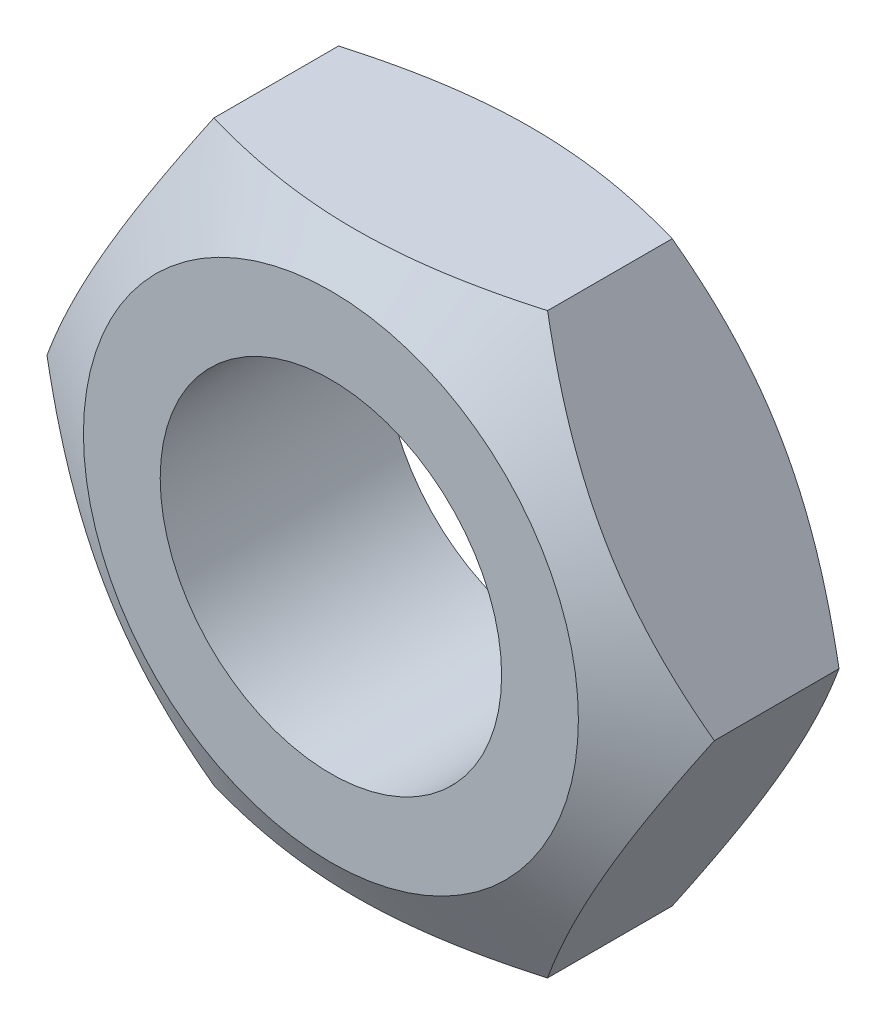
ISO-10303-21;
HEADER;
FILE_DESCRIPTION(('STEP AP214'),'2;1');
FILE_NAME('part.step','',(''),(''),'','','');
FILE_SCHEMA(('AUTOMOTIVE_DESIGN { 1 0 10303 214 1 1 1 1 }'));
ENDSEC;
DATA;
#1=APPLICATION_CONTEXT('core data for automotive mechanical design processes');
#2=APPLICATION_PROTOCOL_DEFINITION('international standard','automotive_design',2000,#1);
#3=PRODUCT_CONTEXT('',#1,'mechanical');
#4=PRODUCT('Part','Part','',(#3));
#5=PRODUCT_RELATED_PRODUCT_CATEGORY('part','',(#4));
#6=PRODUCT_DEFINITION_FORMATION('','',#4);
#7=PRODUCT_DEFINITION_CONTEXT('part definition',#1,'design');
#8=PRODUCT_DEFINITION('design','',#6,#7);
#9=PRODUCT_DEFINITION_SHAPE('','',#8);
#10=(LENGTH_UNIT() NAMED_UNIT(*) SI_UNIT(.MILLI.,.METRE.));
#11=(NAMED_UNIT(*) PLANE_ANGLE_UNIT() SI_UNIT($,.RADIAN.));
#12=(NAMED_UNIT(*) SI_UNIT($,.STERADIAN.) SOLID_ANGLE_UNIT());
#13=UNCERTAINTY_MEASURE_WITH_UNIT(LENGTH_MEASURE(1.E-05),#10,'distance_accuracy_value','');
#14=(GEOMETRIC_REPRESENTATION_CONTEXT(3) GLOBAL_UNCERTAINTY_ASSIGNED_CONTEXT((#13)) GLOBAL_UNIT_ASSIGNED_CONTEXT((#10,
#11,#12)) REPRESENTATION_CONTEXT('',''));
#15=CARTESIAN_POINT('',(0.,0.,0.));
#16=DIRECTION('',(0.,0.,1.));
#17=DIRECTION('',(1.,0.,0.));
#18=AXIS2_PLACEMENT_3D('',#15,#16,#17);
#19=CARTESIAN_POINT('',(4.12159222626818,7.13740000000002,5.5372));
#20=DIRECTION('',(-8.53645842069185E-05,-0.999999996356444,0.));
#21=DIRECTION('',(0.999999996356444,-8.53645842069185E-05,0.));
#22=AXIS2_PLACEMENT_3D('',#19,#20,#21);
#23=PLANE('',#22);
#24=DIRECTION('',(0.,0.,-1.));
#25=VECTOR('',#24,1.);
#26=CARTESIAN_POINT('',(-4.12037360383698,7.13810357198872,5.5372));
#27=LINE('',#26,#25);
#28=CARTESIAN_POINT('',(-4.12037360383698,7.13810357198872,4.30788823694096));
#29=VERTEX_POINT('',#28);
#30=CARTESIAN_POINT('',(-4.12037360383698,7.13810357198872,1.22931176305904));
#31=VERTEX_POINT('',#30);
#32=EDGE_CURVE('E12',#29,#31,#27,.T.);
#33=ORIENTED_EDGE('',*,*,#32,.F.);
#34=CARTESIAN_POINT('',(-4.12057360383698,7.13810358906163,4.30783050086309));
#35=CARTESIAN_POINT('',(-3.93940618814811,7.13808812378047,4.36012084239552));
#36=CARTESIAN_POINT('',(-3.75756329305724,7.13807260083728,4.41003802381626));
#37=CARTESIAN_POINT('',(-3.39240074747005,7.13804142888829,4.50447245527827));
#38=CARTESIAN_POINT('',(-3.20908049601503,7.13802577983119,4.54898737586447));
#39=CARTESIAN_POINT('',(-2.65618459196072,7.13797858210206,4.67355497423284));
#40=CARTESIAN_POINT('',(-2.28442648345868,7.13794684712559,4.74440745196884));
#41=CARTESIAN_POINT('',(-1.72809724572004,7.13789935631135,4.82749006275644));
#42=CARTESIAN_POINT('',(-1.54518834059672,7.13788374236866,4.85115784031085));
#43=CARTESIAN_POINT('',(-1.17854408079075,7.13785244393376,4.89084512282695));
#44=CARTESIAN_POINT('',(-0.99480880057728,7.1378367594479,4.9068653035479));
#45=CARTESIAN_POINT('',(-0.627019148887235,7.1378053632371,4.93084911357203));
#46=CARTESIAN_POINT('',(-0.442965378062387,7.13778965156342,4.93882188592092));
#47=CARTESIAN_POINT('',(-0.0746980003543589,7.13775821457173,4.94654847654521));
#48=CARTESIAN_POINT('',(0.109515601414909,7.13774248925415,4.94630254874227));
#49=CARTESIAN_POINT('',(0.614195268587605,7.13769940748405,4.9343318324784));
#50=CARTESIAN_POINT('',(0.934496113069487,7.13767206513554,4.91423785959537));
#51=CARTESIAN_POINT('',(1.57297040082365,7.13761756204324,4.85052091865647));
#52=CARTESIAN_POINT('',(1.89114159885032,7.13759040149112,4.80687617461222));
#53=CARTESIAN_POINT('',(2.53090070928881,7.13753578872046,4.69777745894697));
#54=CARTESIAN_POINT('',(2.85240790026281,7.13750834339269,4.63186126866467));
#55=CARTESIAN_POINT('',(3.49062782922432,7.13745386201362,4.48225829582427));
#56=CARTESIAN_POINT('',(3.80734874006775,7.13742682526466,4.39860665211493));
#57=CARTESIAN_POINT('',(4.12179222626818,7.1373999829271,4.30783050086309));
#58=B_SPLINE_CURVE_WITH_KNOTS('',3,(#34,#35,#36,#37,#38,#39,#40,#41,#42,#43,#44,#45,#46,#47,#48,
#49,#50,#51,#52,#53,#54,#55,#56,#57),.UNSPECIFIED.,.F.,.F.,(4,2,2,2,2,2,2,2,2,2,2,4),(0.,
0.565643092643378,1.13152923045879,2.26565285271858,2.81882514336941,3.37194854539139,
3.92444280767717,4.47692000033753,5.438702412708,6.40137565540389,7.38539910774354,
8.36749085782236),.UNSPECIFIED.);
#59=CARTESIAN_POINT('',(4.12159222626818,7.13740000000002,4.30788823694096));
#60=VERTEX_POINT('',#59);
#61=EDGE_CURVE('E90',#29,#60,#58,.T.);
#62=ORIENTED_EDGE('',*,*,#61,.T.);
#63=DIRECTION('',(0.,0.,-1.));
#64=VECTOR('',#63,1.);
#65=CARTESIAN_POINT('',(4.12159222626818,7.13740000000002,5.5372));
#66=LINE('',#65,#64);
#67=CARTESIAN_POINT('',(4.12159222626818,7.13740000000002,1.22931176305904));
#68=VERTEX_POINT('',#67);
#69=EDGE_CURVE('E60',#60,#68,#66,.T.);
#70=ORIENTED_EDGE('',*,*,#69,.T.);
#71=CARTESIAN_POINT('',(-4.12057360383698,7.13810358906163,1.22936949913691));
#72=CARTESIAN_POINT('',(-3.93940618814811,7.13808812378047,1.17707915760448));
#73=CARTESIAN_POINT('',(-3.75756329305724,7.13807260083728,1.12716197618374));
#74=CARTESIAN_POINT('',(-3.39240074747005,7.13804142888829,1.03272754472173));
#75=CARTESIAN_POINT('',(-3.20908049601503,7.13802577983119,0.988212624135528));
#76=CARTESIAN_POINT('',(-2.65618459196072,7.13797858210206,0.863645025767163));
#77=CARTESIAN_POINT('',(-2.28442648345868,7.13794684712559,0.792792548031163));
#78=CARTESIAN_POINT('',(-1.72809724572004,7.13789935631135,0.709709937243557));
#79=CARTESIAN_POINT('',(-1.54518834059672,7.13788374236866,0.686042159689147));
#80=CARTESIAN_POINT('',(-1.17854408079075,7.13785244393376,0.646354877173052));
#81=CARTESIAN_POINT('',(-0.99480880057728,7.1378367594479,0.630334696452105));
#82=CARTESIAN_POINT('',(-0.627019148887236,7.1378053632371,0.606350886427972));
#83=CARTESIAN_POINT('',(-0.442965378062388,7.13778965156342,0.598378114079084));
#84=CARTESIAN_POINT('',(-0.0746980003543593,7.13775821457173,0.590651523454793));
#85=CARTESIAN_POINT('',(0.109515601414909,7.13774248925415,0.590897451257725));
#86=CARTESIAN_POINT('',(0.614195268587605,7.13769940748405,0.602868167521598));
#87=CARTESIAN_POINT('',(0.934496113069487,7.13767206513554,0.622962140404627));
#88=CARTESIAN_POINT('',(1.57297040082365,7.13761756204324,0.686679081343524));
#89=CARTESIAN_POINT('',(1.89114159885032,7.13759040149112,0.730323825387775));
#90=CARTESIAN_POINT('',(2.53090070928881,7.13753578872046,0.839422541053031));
#91=CARTESIAN_POINT('',(2.85240790026281,7.13750834339269,0.905338731335329));
#92=CARTESIAN_POINT('',(3.49062782922432,7.13745386201362,1.05494170417573));
#93=CARTESIAN_POINT('',(3.80734874006775,7.13742682526466,1.13859334788507));
#94=CARTESIAN_POINT('',(4.12179222626818,7.1373999829271,1.22936949913691));
#95=B_SPLINE_CURVE_WITH_KNOTS('',3,(#71,#72,#73,#74,#75,#76,#77,#78,#79,#80,#81,#82,#83,#84,#85,
#86,#87,#88,#89,#90,#91,#92,#93,#94),.UNSPECIFIED.,.F.,.F.,(4,2,2,2,2,2,2,2,2,2,2,4),(0.,
0.565643092643377,1.13152923045879,2.26565285271858,2.81882514336941,3.37194854539139,
3.92444280767717,4.47692000033753,5.438702412708,6.40137565540389,7.38539910774354,
8.36749085782236),.UNSPECIFIED.);
#96=EDGE_CURVE('E105',#31,#68,#95,.T.);
#97=ORIENTED_EDGE('',*,*,#96,.F.);
#98=EDGE_LOOP('',(#33,#62,#70,#97));
#99=FACE_BOUND('',#98,.T.);
#100=ADVANCED_FACE('F37',(#99),#23,.F.);
#101=CARTESIAN_POINT('',(-4.12037360383698,7.13810357198872,5.5372));
#102=DIRECTION('',(0.865982718336923,-0.500073926076728,0.));
#103=DIRECTION('',(0.500073926076728,0.865982718336923,0.));
#104=AXIS2_PLACEMENT_3D('',#101,#102,#103);
#105=PLANE('',#104);
#106=DIRECTION('',(0.,0.,-1.));
#107=VECTOR('',#106,1.);
#108=CARTESIAN_POINT('',(-8.24196583010516,0.000703571988696326,5.5372));
#109=LINE('',#108,#107);
#110=CARTESIAN_POINT('',(-8.24196583010516,0.000703571988696322,4.30788823694096));
#111=VERTEX_POINT('',#110);
#112=CARTESIAN_POINT('',(-8.24196583010516,0.000703571988696415,1.22931176305904));
#113=VERTEX_POINT('',#112);
#114=EDGE_CURVE('E45',#111,#113,#109,.T.);
#115=ORIENTED_EDGE('',*,*,#114,.F.);
#116=CARTESIAN_POINT('',(-8.24208132292401,0.000503571988696059,4.30782156558708));
#117=CARTESIAN_POINT('',(-8.15148409142813,0.157391649357806,4.36011227679419));
#118=CARTESIAN_POINT('',(-8.06054906965497,0.314864681325208,4.41002983682875));
#119=CARTESIAN_POINT('',(-7.87794053652239,0.631089594618148,4.50446504195507));
#120=CARTESIAN_POINT('',(-7.78626672463784,0.789841996365864,4.54898035759713));
#121=CARTESIAN_POINT('',(-7.50977748185588,1.26864101701007,4.67354916871746));
#122=CARTESIAN_POINT('',(-7.32387065552509,1.59057761563735,4.74440248507118));
#123=CARTESIAN_POINT('',(-7.04566447336461,2.07234987634206,4.82748634545603));
#124=CARTESIAN_POINT('',(-6.95419636407978,2.23074606096429,4.85115453172131));
#125=CARTESIAN_POINT('',(-6.77084685159904,2.54825413515942,4.89084262777208));
#126=CARTESIAN_POINT('',(-6.6789654856441,2.70736596024178,4.90686321332019));
#127=CARTESIAN_POINT('',(-6.49504317751791,3.02586595004025,4.93084781862488));
#128=CARTESIAN_POINT('',(-6.40300253573183,3.18525359457655,4.93882098158994));
#129=CARTESIAN_POINT('',(-6.21884131371931,3.50416731379769,4.94654833008856));
#130=CARTESIAN_POINT('',(-6.12672073605035,3.66369338405374,4.94630276953199));
#131=CARTESIAN_POINT('',(-5.87434113951377,4.10074150367113,4.9343329173484));
#132=CARTESIAN_POINT('',(-5.71416473796686,4.37812048384163,4.91423909336681));
#133=CARTESIAN_POINT('',(-5.3948758117313,4.93103611862705,4.85052174977164));
#134=CARTESIAN_POINT('',(-5.23576440990609,5.2065708287688,4.80687645256949));
#135=CARTESIAN_POINT('',(-4.91583293113429,5.76059917782102,4.69777601034158));
#136=CARTESIAN_POINT('',(-4.75505322289479,6.03902290986197,4.63185862444789));
#137=CARTESIAN_POINT('',(-4.43589146689861,6.5917183227485,4.48225280608254));
#138=CARTESIAN_POINT('',(-4.27750533182939,6.86599708163159,4.39859951471614));
#139=CARTESIAN_POINT('',(-4.12025811101813,7.13830357198872,4.30782156558708));
#140=B_SPLINE_CURVE_WITH_KNOTS('',3,(#116,#117,#118,#119,#120,#121,#122,#123,#124,#125,#126,
#127,#128,#129,#130,#131,#132,#133,#134,#135,#136,#137,#138,#139),.UNSPECIFIED.,.F.,.F.,(4,2,2,
2,2,2,2,2,2,2,2,4),(0.,0.565644151526927,1.13153134884938,2.2656571484123,2.81883039756829,
3.37195475779125,3.9244499670524,4.47692810750022,5.43872421707767,6.40141120861208,
7.38544913724525,8.36755526096864),.UNSPECIFIED.);
#141=EDGE_CURVE('E98',#111,#29,#140,.T.);
#142=ORIENTED_EDGE('',*,*,#141,.T.);
#143=ORIENTED_EDGE('',*,*,#32,.T.);
#144=CARTESIAN_POINT('',(-8.24208132292401,0.000503571988696117,1.22937843441292));
#145=CARTESIAN_POINT('',(-8.15148409142813,0.157391649357807,1.17708772320581));
#146=CARTESIAN_POINT('',(-8.06054906965497,0.314864681325208,1.12717016317125));
#147=CARTESIAN_POINT('',(-7.87794053652239,0.631089594618148,1.03273495804492));
#148=CARTESIAN_POINT('',(-7.78626672463784,0.789841996365864,0.988219642402865));
#149=CARTESIAN_POINT('',(-7.50977748185588,1.26864101701007,0.863650831282538));
#150=CARTESIAN_POINT('',(-7.32387065552508,1.59057761563735,0.792797514928821));
#151=CARTESIAN_POINT('',(-7.04566447336461,2.07234987634206,0.709713654543974));
#152=CARTESIAN_POINT('',(-6.95419636407978,2.23074606096429,0.686045468278691));
#153=CARTESIAN_POINT('',(-6.77084685159904,2.54825413515942,0.646357372227925));
#154=CARTESIAN_POINT('',(-6.6789654856441,2.70736596024178,0.630336786679808));
#155=CARTESIAN_POINT('',(-6.49504317751791,3.02586595004025,0.606352181375122));
#156=CARTESIAN_POINT('',(-6.40300253573183,3.18525359457655,0.598379018410062));
#157=CARTESIAN_POINT('',(-6.21884131371931,3.50416731379769,0.59065166991144));
#158=CARTESIAN_POINT('',(-6.12672073605035,3.66369338405374,0.590897230468007));
#159=CARTESIAN_POINT('',(-5.87434113951377,4.10074150367113,0.602867082651604));
#160=CARTESIAN_POINT('',(-5.71416473796686,4.37812048384163,0.622960906633185));
#161=CARTESIAN_POINT('',(-5.3948758117313,4.93103611862705,0.686678250228364));
#162=CARTESIAN_POINT('',(-5.23576440990609,5.2065708287688,0.73032354743051));
#163=CARTESIAN_POINT('',(-4.91583293113429,5.76059917782102,0.83942398965842));
#164=CARTESIAN_POINT('',(-4.7550532228948,6.03902290986197,0.905341375552106));
#165=CARTESIAN_POINT('',(-4.43589146689861,6.5917183227485,1.05494719391746));
#166=CARTESIAN_POINT('',(-4.27750533182939,6.86599708163159,1.13860048528385));
#167=CARTESIAN_POINT('',(-4.12025811101813,7.13830357198872,1.22937843441292));
#168=B_SPLINE_CURVE_WITH_KNOTS('',3,(#144,#145,#146,#147,#148,#149,#150,#151,#152,#153,#154,
#155,#156,#157,#158,#159,#160,#161,#162,#163,#164,#165,#166,#167),.UNSPECIFIED.,.F.,.F.,(4,2,2,
2,2,2,2,2,2,2,2,4),(0.,0.565644151526927,1.13153134884938,2.2656571484123,2.81883039756829,
3.37195475779125,3.9244499670524,4.47692810750022,5.43872421707767,6.40141120861208,
7.38544913724525,8.36755526096864),.UNSPECIFIED.);
#169=EDGE_CURVE('E109',#113,#31,#168,.T.);
#170=ORIENTED_EDGE('',*,*,#169,.F.);
#171=EDGE_LOOP('',(#115,#142,#143,#170));
#172=FACE_BOUND('',#171,.T.);
#173=ADVANCED_FACE('F138',(#172),#105,.F.);
#174=CARTESIAN_POINT('',(-8.24196583010516,0.000703571988696326,5.5372));
#175=DIRECTION('',(0.86606808292113,0.499926070279715,0.));
#176=DIRECTION('',(-0.499926070279715,0.86606808292113,0.));
#177=AXIS2_PLACEMENT_3D('',#174,#175,#176);
#178=PLANE('',#177);
#179=DIRECTION('',(0.,0.,-1.));
#180=VECTOR('',#179,1.);
#181=CARTESIAN_POINT('',(-4.12159222626818,-7.13740000000002,5.5372));
#182=LINE('',#181,#180);
#183=CARTESIAN_POINT('',(-4.12159222626818,-7.13740000000002,4.30788823694096));
#184=VERTEX_POINT('',#183);
#185=CARTESIAN_POINT('',(-4.12159222626818,-7.13740000000002,1.22931176305904));
#186=VERTEX_POINT('',#185);
#187=EDGE_CURVE('E118',#184,#186,#182,.T.);
#188=ORIENTED_EDGE('',*,*,#187,.F.);
#189=CARTESIAN_POINT('',(-4.12147677897711,-7.13760000000002,4.30782157215873));
#190=CARTESIAN_POINT('',(-4.2120472236859,-6.9806964574935,4.36011228309395));
#191=CARTESIAN_POINT('',(-4.30295535879776,-6.82320790272737,4.41002984285005));
#192=CARTESIAN_POINT('',(-4.4855099002581,-6.50695181777735,4.50446504740737));
#193=CARTESIAN_POINT('',(-4.57715660704286,-6.34818376711998,4.54898036275888));
#194=CARTESIAN_POINT('',(-4.85356410053077,-5.86933754920587,4.67354917298726));
#195=CARTESIAN_POINT('',(-5.03941595997222,-5.54736921592066,4.7444024887242));
#196=CARTESIAN_POINT('',(-5.31753988518105,-5.06554946488159,4.82748634819001));
#197=CARTESIAN_POINT('',(-5.40898095018502,-4.90713766646519,4.8511545341547));
#198=CARTESIAN_POINT('',(-5.59227625190039,-4.58959829414107,4.89084262960713));
#199=CARTESIAN_POINT('',(-5.68413045138184,-4.43047078473024,4.90686321485751));
#200=CARTESIAN_POINT('',(-5.86799837937434,-4.11193939904346,4.93084781957729));
#201=CARTESIAN_POINT('',(-5.96001180758906,-3.95253604299857,4.93882098225506));
#202=CARTESIAN_POINT('',(-6.14411857881728,-3.63359088712539,4.94654833019629));
#203=CARTESIAN_POINT('',(-6.23621191927408,-3.47404909172634,4.94630276936963));
#204=CARTESIAN_POINT('',(-6.48851689346707,-3.03695789304465,4.93433291655052));
#205=CARTESIAN_POINT('',(-6.64864593430591,-2.75955157306278,4.91423909245942));
#206=CARTESIAN_POINT('',(-6.96784045369349,-2.20658144023843,4.85052174916038));
#207=CARTESIAN_POINT('',(-7.12690480971084,-1.93101957206069,4.80687645236506));
#208=CARTESIAN_POINT('',(-7.44674169161854,-1.37693661534214,4.69777601140699));
#209=CARTESIAN_POINT('',(-7.607473860739,-1.09848544055938,4.63185862639264));
#210=CARTESIAN_POINT('',(-7.9265412474668,-0.545735551377989,4.48225281012009));
#211=CARTESIAN_POINT('',(-8.08488055117797,-0.271429758244471,4.3985995199655));
#212=CARTESIAN_POINT('',(-8.24208127739623,0.000903571988697267,4.30782157215873));
#213=B_SPLINE_CURVE_WITH_KNOTS('',3,(#189,#190,#191,#192,#193,#194,#195,#196,#197,#198,#199,
#200,#201,#202,#203,#204,#205,#206,#207,#208,#209,#210,#211,#212),.UNSPECIFIED.,.F.,.F.,(4,2,2,
2,2,2,2,2,2,2,2,4),(0.,0.565644150748149,1.13153134729136,2.26565714525293,2.81883039370397,
3.37195475322221,3.92444996178688,4.47692810153763,5.4387242010412,6.40141118246375,
7.38544910045004,8.36755521360205),.UNSPECIFIED.);
#214=EDGE_CURVE('E127',#184,#111,#213,.T.);
#215=ORIENTED_EDGE('',*,*,#214,.T.);
#216=ORIENTED_EDGE('',*,*,#114,.T.);
#217=CARTESIAN_POINT('',(-4.12147677897711,-7.13760000000002,1.22937842784127));
#218=CARTESIAN_POINT('',(-4.2120472236859,-6.9806964574935,1.17708771690605));
#219=CARTESIAN_POINT('',(-4.30295535879776,-6.82320790272737,1.12717015714995));
#220=CARTESIAN_POINT('',(-4.4855099002581,-6.50695181777735,1.03273495259263));
#221=CARTESIAN_POINT('',(-4.57715660704286,-6.34818376711998,0.988219637241121));
#222=CARTESIAN_POINT('',(-4.85356410053077,-5.86933754920587,0.863650827012737));
#223=CARTESIAN_POINT('',(-5.03941595997222,-5.54736921592066,0.792797511275799));
#224=CARTESIAN_POINT('',(-5.31753988518105,-5.06554946488159,0.709713651809992));
#225=CARTESIAN_POINT('',(-5.40898095018502,-4.90713766646519,0.686045465845303));
#226=CARTESIAN_POINT('',(-5.59227625190039,-4.58959829414107,0.646357370392867));
#227=CARTESIAN_POINT('',(-5.68413045138184,-4.43047078473024,0.630336785142488));
#228=CARTESIAN_POINT('',(-5.86799837937435,-4.11193939904346,0.606352180422708));
#229=CARTESIAN_POINT('',(-5.96001180758906,-3.95253604299857,0.598379017744935));
#230=CARTESIAN_POINT('',(-6.14411857881728,-3.6335908871254,0.590651669803707));
#231=CARTESIAN_POINT('',(-6.23621191927408,-3.47404909172634,0.590897230630372));
#232=CARTESIAN_POINT('',(-6.48851689346707,-3.03695789304465,0.602867083449481));
#233=CARTESIAN_POINT('',(-6.64864593430591,-2.75955157306278,0.622960907540579));
#234=CARTESIAN_POINT('',(-6.96784045369349,-2.20658144023843,0.686678250839623));
#235=CARTESIAN_POINT('',(-7.12690480971084,-1.93101957206069,0.730323547634939));
#236=CARTESIAN_POINT('',(-7.44674169161854,-1.37693661534214,0.839423988593012));
#237=CARTESIAN_POINT('',(-7.607473860739,-1.09848544055938,0.905341373607359));
#238=CARTESIAN_POINT('',(-7.9265412474668,-0.545735551377989,1.05494718987991));
#239=CARTESIAN_POINT('',(-8.08488055117797,-0.271429758244471,1.1386004800345));
#240=CARTESIAN_POINT('',(-8.24208127739623,0.000903571988697285,1.22937842784127));
#241=B_SPLINE_CURVE_WITH_KNOTS('',3,(#217,#218,#219,#220,#221,#222,#223,#224,#225,#226,#227,
#228,#229,#230,#231,#232,#233,#234,#235,#236,#237,#238,#239,#240),.UNSPECIFIED.,.F.,.F.,(4,2,2,
2,2,2,2,2,2,2,2,4),(0.,0.565644150748149,1.13153134729136,2.26565714525294,2.81883039370397,
3.37195475322221,3.92444996178688,4.47692810153763,5.4387242010412,6.40141118246375,
7.38544910045004,8.36755521360205),.UNSPECIFIED.);
#242=EDGE_CURVE('E126',#186,#113,#241,.T.);
#243=ORIENTED_EDGE('',*,*,#242,.F.);
#244=EDGE_LOOP('',(#188,#215,#216,#243));
#245=FACE_BOUND('',#244,.T.);
#246=ADVANCED_FACE('F125',(#245),#178,.F.);
#247=CARTESIAN_POINT('',(-4.12159222626818,-7.13740000000002,5.5372));
#248=DIRECTION('',(8.53645842068133E-05,0.999999996356444,0.));
#249=DIRECTION('',(-0.999999996356444,8.53645842068133E-05,0.));
#250=AXIS2_PLACEMENT_3D('',#247,#248,#249);
#251=PLANE('',#250);
#252=DIRECTION('',(0.,0.,-1.));
#253=VECTOR('',#252,1.);
#254=CARTESIAN_POINT('',(4.12037360383698,-7.13810357198872,5.5372));
#255=LINE('',#254,#253);
#256=CARTESIAN_POINT('',(4.12037360383698,-7.13810357198872,4.30788823694096));
#257=VERTEX_POINT('',#256);
#258=CARTESIAN_POINT('',(4.12037360383698,-7.13810357198872,1.22931176305904));
#259=VERTEX_POINT('',#258);
#260=EDGE_CURVE('E107',#257,#259,#255,.T.);
#261=ORIENTED_EDGE('',*,*,#260,.F.);
#262=CARTESIAN_POINT('',(4.12057360383698,-7.13810358906163,4.30783050086309));
#263=CARTESIAN_POINT('',(3.93940618814811,-7.13808812378046,4.36012084239552));
#264=CARTESIAN_POINT('',(3.75756329305724,-7.13807260083728,4.41003802381626));
#265=CARTESIAN_POINT('',(3.39240074747005,-7.13804142888829,4.50447245527827));
#266=CARTESIAN_POINT('',(3.20908049601503,-7.13802577983119,4.54898737586447));
#267=CARTESIAN_POINT('',(2.65618459196072,-7.13797858210206,4.67355497423284));
#268=CARTESIAN_POINT('',(2.28442648345868,-7.13794684712559,4.74440745196884));
#269=CARTESIAN_POINT('',(1.72809724572004,-7.13789935631135,4.82749006275644));
#270=CARTESIAN_POINT('',(1.54518834059672,-7.13788374236866,4.85115784031085));
#271=CARTESIAN_POINT('',(1.17854408079075,-7.13785244393376,4.89084512282695));
#272=CARTESIAN_POINT('',(0.994808800577282,-7.1378367594479,4.9068653035479));
#273=CARTESIAN_POINT('',(0.627019148887237,-7.1378053632371,4.93084911357203));
#274=CARTESIAN_POINT('',(0.44296537806239,-7.13778965156342,4.93882188592092));
#275=CARTESIAN_POINT('',(0.0746980003543614,-7.13775821457173,4.94654847654521));
#276=CARTESIAN_POINT('',(-0.109515601414907,-7.13774248925415,4.94630254874228));
#277=CARTESIAN_POINT('',(-0.614195268587602,-7.13769940748405,4.9343318324784));
#278=CARTESIAN_POINT('',(-0.934496113069484,-7.13767206513554,4.91423785959537));
#279=CARTESIAN_POINT('',(-1.57297040082365,-7.13761756204324,4.85052091865647));
#280=CARTESIAN_POINT('',(-1.89114159885032,-7.13759040149112,4.80687617461223));
#281=CARTESIAN_POINT('',(-2.53090070928881,-7.13753578872046,4.69777745894697));
#282=CARTESIAN_POINT('',(-2.85240790026281,-7.13750834339269,4.63186126866467));
#283=CARTESIAN_POINT('',(-3.49062782922432,-7.13745386201362,4.48225829582427));
#284=CARTESIAN_POINT('',(-3.80734874006774,-7.13742682526466,4.39860665211493));
#285=CARTESIAN_POINT('',(-4.12179222626818,-7.1373999829271,4.30783050086309));
#286=B_SPLINE_CURVE_WITH_KNOTS('',3,(#262,#263,#264,#265,#266,#267,#268,#269,#270,#271,#272,
#273,#274,#275,#276,#277,#278,#279,#280,#281,#282,#283,#284,#285),.UNSPECIFIED.,.F.,.F.,(4,2,2,
2,2,2,2,2,2,2,2,4),(0.,0.565643092643377,1.13152923045879,2.26565285271858,2.81882514336941,
3.37194854539139,3.92444280767717,4.47692000033753,5.438702412708,6.40137565540389,
7.38539910774354,8.36749085782236),.UNSPECIFIED.);
#287=EDGE_CURVE('E188',#257,#184,#286,.T.);
#288=ORIENTED_EDGE('',*,*,#287,.T.);
#289=ORIENTED_EDGE('',*,*,#187,.T.);
#290=CARTESIAN_POINT('',(4.12057360383698,-7.13810358906163,1.22936949913691));
#291=CARTESIAN_POINT('',(3.93940618814811,-7.13808812378046,1.17707915760448));
#292=CARTESIAN_POINT('',(3.75756329305724,-7.13807260083728,1.12716197618374));
#293=CARTESIAN_POINT('',(3.39240074747005,-7.13804142888829,1.03272754472173));
#294=CARTESIAN_POINT('',(3.20908049601503,-7.13802577983119,0.988212624135528));
#295=CARTESIAN_POINT('',(2.65618459196072,-7.13797858210206,0.863645025767162));
#296=CARTESIAN_POINT('',(2.28442648345868,-7.13794684712559,0.792792548031163));
#297=CARTESIAN_POINT('',(1.72809724572004,-7.13789935631135,0.709709937243556));
#298=CARTESIAN_POINT('',(1.54518834059672,-7.13788374236866,0.686042159689146));
#299=CARTESIAN_POINT('',(1.17854408079075,-7.13785244393376,0.646354877173051));
#300=CARTESIAN_POINT('',(0.99480880057728,-7.1378367594479,0.630334696452105));
#301=CARTESIAN_POINT('',(0.627019148887236,-7.1378053632371,0.606350886427972));
#302=CARTESIAN_POINT('',(0.442965378062388,-7.13778965156342,0.598378114079084));
#303=CARTESIAN_POINT('',(0.0746980003543596,-7.13775821457173,0.590651523454793));
#304=CARTESIAN_POINT('',(-0.109515601414909,-7.13774248925415,0.590897451257724));
#305=CARTESIAN_POINT('',(-0.614195268587604,-7.13769940748405,0.602868167521598));
#306=CARTESIAN_POINT('',(-0.934496113069486,-7.13767206513554,0.622962140404627));
#307=CARTESIAN_POINT('',(-1.57297040082365,-7.13761756204324,0.686679081343524));
#308=CARTESIAN_POINT('',(-1.89114159885032,-7.13759040149112,0.730323825387776));
#309=CARTESIAN_POINT('',(-2.53090070928881,-7.13753578872046,0.839422541053031));
#310=CARTESIAN_POINT('',(-2.85240790026281,-7.13750834339269,0.905338731335329));
#311=CARTESIAN_POINT('',(-3.49062782922432,-7.13745386201362,1.05494170417573));
#312=CARTESIAN_POINT('',(-3.80734874006775,-7.13742682526466,1.13859334788507));
#313=CARTESIAN_POINT('',(-4.12179222626818,-7.1373999829271,1.22936949913691));
#314=B_SPLINE_CURVE_WITH_KNOTS('',3,(#290,#291,#292,#293,#294,#295,#296,#297,#298,#299,#300,
#301,#302,#303,#304,#305,#306,#307,#308,#309,#310,#311,#312,#313),.UNSPECIFIED.,.F.,.F.,(4,2,2,
2,2,2,2,2,2,2,2,4),(0.,0.565643092643377,1.13152923045879,2.26565285271858,2.81882514336941,
3.37194854539139,3.92444280767717,4.47692000033753,5.438702412708,6.40137565540389,
7.38539910774354,8.36749085782236),.UNSPECIFIED.);
#315=EDGE_CURVE('E136',#259,#186,#314,.T.);
#316=ORIENTED_EDGE('',*,*,#315,.F.);
#317=EDGE_LOOP('',(#261,#288,#289,#316));
#318=FACE_BOUND('',#317,.T.);
#319=ADVANCED_FACE('F179',(#318),#251,.F.);
#320=CARTESIAN_POINT('',(4.12037360383698,-7.13810357198872,5.5372));
#321=DIRECTION('',(-0.865982718336923,0.500073926076729,0.));
#322=DIRECTION('',(-0.500073926076729,-0.865982718336923,0.));
#323=AXIS2_PLACEMENT_3D('',#320,#321,#322);
#324=PLANE('',#323);
#325=DIRECTION('',(0.,0.,-1.));
#326=VECTOR('',#325,1.);
#327=CARTESIAN_POINT('',(8.24196583010516,-0.000703571988695459,5.5372));
#328=LINE('',#327,#326);
#329=CARTESIAN_POINT('',(8.24196583010516,-0.000703571988695459,4.30788823694096));
#330=VERTEX_POINT('',#329);
#331=CARTESIAN_POINT('',(8.24196583010516,-0.000703571988695547,1.22931176305904));
#332=VERTEX_POINT('',#331);
#333=EDGE_CURVE('E104',#330,#332,#328,.T.);
#334=ORIENTED_EDGE('',*,*,#333,.F.);
#335=CARTESIAN_POINT('',(8.24208132292401,-0.00050357198869525,4.30782156558708));
#336=CARTESIAN_POINT('',(8.15148409142813,-0.157391649357806,4.36011227679419));
#337=CARTESIAN_POINT('',(8.06054906965498,-0.314864681325208,4.41002983682875));
#338=CARTESIAN_POINT('',(7.87794053652239,-0.631089594618147,4.50446504195507));
#339=CARTESIAN_POINT('',(7.78626672463784,-0.789841996365863,4.54898035759713));
#340=CARTESIAN_POINT('',(7.50977748185588,-1.26864101701007,4.67354916871746));
#341=CARTESIAN_POINT('',(7.32387065552509,-1.59057761563735,4.74440248507118));
#342=CARTESIAN_POINT('',(7.04566447336461,-2.07234987634206,4.82748634545603));
#343=CARTESIAN_POINT('',(6.95419636407978,-2.23074606096429,4.85115453172131));
#344=CARTESIAN_POINT('',(6.77084685159904,-2.54825413515942,4.89084262777208));
#345=CARTESIAN_POINT('',(6.6789654856441,-2.70736596024178,4.90686321332019));
#346=CARTESIAN_POINT('',(6.49504317751791,-3.02586595004025,4.93084781862488));
#347=CARTESIAN_POINT('',(6.40300253573183,-3.18525359457655,4.93882098158994));
#348=CARTESIAN_POINT('',(6.21884131371931,-3.50416731379769,4.94654833008856));
#349=CARTESIAN_POINT('',(6.12672073605035,-3.66369338405373,4.94630276953199));
#350=CARTESIAN_POINT('',(5.87434113951378,-4.10074150367113,4.9343329173484));
#351=CARTESIAN_POINT('',(5.71416473796686,-4.37812048384163,4.91423909336681));
#352=CARTESIAN_POINT('',(5.3948758117313,-4.93103611862705,4.85052174977164));
#353=CARTESIAN_POINT('',(5.23576440990609,-5.2065708287688,4.80687645256949));
#354=CARTESIAN_POINT('',(4.91583293113429,-5.76059917782102,4.69777601034158));
#355=CARTESIAN_POINT('',(4.7550532228948,-6.03902290986197,4.6318586244479));
#356=CARTESIAN_POINT('',(4.43589146689861,-6.5917183227485,4.48225280608254));
#357=CARTESIAN_POINT('',(4.27750533182939,-6.86599708163159,4.39859951471615));
#358=CARTESIAN_POINT('',(4.12025811101813,-7.13830357198872,4.30782156558708));
#359=B_SPLINE_CURVE_WITH_KNOTS('',3,(#335,#336,#337,#338,#339,#340,#341,#342,#343,#344,#345,
#346,#347,#348,#349,#350,#351,#352,#353,#354,#355,#356,#357,#358),.UNSPECIFIED.,.F.,.F.,(4,2,2,
2,2,2,2,2,2,2,2,4),(0.,0.565644151526928,1.13153134884938,2.2656571484123,2.81883039756829,
3.37195475779125,3.9244499670524,4.47692810750022,5.43872421707767,6.40141120861208,
7.38544913724525,8.36755526096864),.UNSPECIFIED.);
#360=EDGE_CURVE('E52',#330,#257,#359,.T.);
#361=ORIENTED_EDGE('',*,*,#360,.T.);
#362=ORIENTED_EDGE('',*,*,#260,.T.);
#363=CARTESIAN_POINT('',(8.24208132292401,-0.00050357198869525,1.22937843441292));
#364=CARTESIAN_POINT('',(8.15148409142813,-0.157391649357806,1.17708772320581));
#365=CARTESIAN_POINT('',(8.06054906965498,-0.314864681325208,1.12717016317125));
#366=CARTESIAN_POINT('',(7.87794053652239,-0.631089594618147,1.03273495804493));
#367=CARTESIAN_POINT('',(7.78626672463784,-0.789841996365863,0.988219642402866));
#368=CARTESIAN_POINT('',(7.50977748185588,-1.26864101701007,0.863650831282538));
#369=CARTESIAN_POINT('',(7.32387065552509,-1.59057761563735,0.792797514928822));
#370=CARTESIAN_POINT('',(7.04566447336461,-2.07234987634206,0.709713654543974));
#371=CARTESIAN_POINT('',(6.95419636407979,-2.23074606096429,0.686045468278691));
#372=CARTESIAN_POINT('',(6.77084685159904,-2.54825413515942,0.646357372227925));
#373=CARTESIAN_POINT('',(6.6789654856441,-2.70736596024178,0.630336786679807));
#374=CARTESIAN_POINT('',(6.49504317751791,-3.02586595004025,0.606352181375122));
#375=CARTESIAN_POINT('',(6.40300253573183,-3.18525359457655,0.598379018410063));
#376=CARTESIAN_POINT('',(6.21884131371931,-3.50416731379769,0.59065166991144));
#377=CARTESIAN_POINT('',(6.12672073605035,-3.66369338405373,0.590897230468006));
#378=CARTESIAN_POINT('',(5.87434113951378,-4.10074150367113,0.602867082651603));
#379=CARTESIAN_POINT('',(5.71416473796686,-4.37812048384163,0.622960906633185));
#380=CARTESIAN_POINT('',(5.3948758117313,-4.93103611862705,0.686678250228365));
#381=CARTESIAN_POINT('',(5.23576440990609,-5.2065708287688,0.73032354743051));
#382=CARTESIAN_POINT('',(4.91583293113429,-5.76059917782102,0.839423989658419));
#383=CARTESIAN_POINT('',(4.7550532228948,-6.03902290986197,0.905341375552105));
#384=CARTESIAN_POINT('',(4.43589146689861,-6.5917183227485,1.05494719391746));
#385=CARTESIAN_POINT('',(4.27750533182939,-6.86599708163159,1.13860048528385));
#386=CARTESIAN_POINT('',(4.12025811101813,-7.13830357198872,1.22937843441292));
#387=B_SPLINE_CURVE_WITH_KNOTS('',3,(#363,#364,#365,#366,#367,#368,#369,#370,#371,#372,#373,
#374,#375,#376,#377,#378,#379,#380,#381,#382,#383,#384,#385,#386),.UNSPECIFIED.,.F.,.F.,(4,2,2,
2,2,2,2,2,2,2,2,4),(0.,0.565644151526928,1.13153134884938,2.2656571484123,2.81883039756829,
3.37195475779125,3.9244499670524,4.47692810750022,5.43872421707767,6.40141120861208,
7.38544913724525,8.36755526096864),.UNSPECIFIED.);
#388=EDGE_CURVE('E170',#332,#259,#387,.T.);
#389=ORIENTED_EDGE('',*,*,#388,.F.);
#390=EDGE_LOOP('',(#334,#361,#362,#389));
#391=FACE_BOUND('',#390,.T.);
#392=ADVANCED_FACE('F182',(#391),#324,.F.);
#393=CARTESIAN_POINT('',(8.24196583010516,-0.000703571988695459,5.5372));
#394=DIRECTION('',(-0.86606808292113,-0.499926070279716,0.));
#395=DIRECTION('',(0.499926070279716,-0.86606808292113,0.));
#396=AXIS2_PLACEMENT_3D('',#393,#394,#395);
#397=PLANE('',#396);
#398=ORIENTED_EDGE('',*,*,#69,.F.);
#399=CARTESIAN_POINT('',(4.12147677897711,7.13760000000002,4.30782157215873));
#400=CARTESIAN_POINT('',(4.2120472236859,6.9806964574935,4.36011228309395));
#401=CARTESIAN_POINT('',(4.30295535879776,6.82320790272737,4.41002984285005));
#402=CARTESIAN_POINT('',(4.48550990025811,6.50695181777735,4.50446504740737));
#403=CARTESIAN_POINT('',(4.57715660704286,6.34818376711999,4.54898036275888));
#404=CARTESIAN_POINT('',(4.85356410053077,5.86933754920587,4.67354917298726));
#405=CARTESIAN_POINT('',(5.03941595997222,5.54736921592066,4.7444024887242));
#406=CARTESIAN_POINT('',(5.31753988518106,5.06554946488158,4.82748634819001));
#407=CARTESIAN_POINT('',(5.40898095018502,4.90713766646519,4.85115453415469));
#408=CARTESIAN_POINT('',(5.5922762519004,4.58959829414107,4.89084262960713));
#409=CARTESIAN_POINT('',(5.68413045138185,4.43047078473024,4.90686321485751));
#410=CARTESIAN_POINT('',(5.86799837937435,4.11193939904346,4.93084781957729));
#411=CARTESIAN_POINT('',(5.96001180758906,3.95253604299857,4.93882098225506));
#412=CARTESIAN_POINT('',(6.14411857881729,3.6335908871254,4.94654833019629));
#413=CARTESIAN_POINT('',(6.23621191927408,3.47404909172634,4.94630276936963));
#414=CARTESIAN_POINT('',(6.48851689346707,3.03695789304465,4.93433291655052));
#415=CARTESIAN_POINT('',(6.64864593430591,2.75955157306278,4.91423909245942));
#416=CARTESIAN_POINT('',(6.96784045369349,2.20658144023843,4.85052174916038));
#417=CARTESIAN_POINT('',(7.12690480971085,1.93101957206069,4.80687645236506));
#418=CARTESIAN_POINT('',(7.44674169161854,1.37693661534214,4.69777601140699));
#419=CARTESIAN_POINT('',(7.607473860739,1.09848544055938,4.63185862639264));
#420=CARTESIAN_POINT('',(7.9265412474668,0.545735551377991,4.48225281012009));
#421=CARTESIAN_POINT('',(8.08488055117797,0.271429758244473,4.3985995199655));
#422=CARTESIAN_POINT('',(8.24208127739623,-0.000903571988696104,4.30782157215872));
#423=B_SPLINE_CURVE_WITH_KNOTS('',3,(#399,#400,#401,#402,#403,#404,#405,#406,#407,#408,#409,
#410,#411,#412,#413,#414,#415,#416,#417,#418,#419,#420,#421,#422),.UNSPECIFIED.,.F.,.F.,(4,2,2,
2,2,2,2,2,2,2,2,4),(0.,0.565644150748148,1.13153134729136,2.26565714525294,2.81883039370397,
3.37195475322221,3.92444996178688,4.47692810153763,5.4387242010412,6.40141118246375,
7.38544910045004,8.36755521360205),.UNSPECIFIED.);
#424=EDGE_CURVE('E88',#60,#330,#423,.T.);
#425=ORIENTED_EDGE('',*,*,#424,.T.);
#426=ORIENTED_EDGE('',*,*,#333,.T.);
#427=CARTESIAN_POINT('',(4.12147677897711,7.13760000000002,1.22937842784127));
#428=CARTESIAN_POINT('',(4.2120472236859,6.9806964574935,1.17708771690605));
#429=CARTESIAN_POINT('',(4.30295535879776,6.82320790272737,1.12717015714995));
#430=CARTESIAN_POINT('',(4.48550990025811,6.50695181777735,1.03273495259263));
#431=CARTESIAN_POINT('',(4.57715660704286,6.34818376711999,0.988219637241122));
#432=CARTESIAN_POINT('',(4.85356410053077,5.86933754920587,0.863650827012737));
#433=CARTESIAN_POINT('',(5.03941595997222,5.54736921592066,0.792797511275799));
#434=CARTESIAN_POINT('',(5.31753988518106,5.06554946488159,0.709713651809993));
#435=CARTESIAN_POINT('',(5.40898095018502,4.90713766646519,0.686045465845304));
#436=CARTESIAN_POINT('',(5.5922762519004,4.58959829414107,0.646357370392868));
#437=CARTESIAN_POINT('',(5.68413045138185,4.43047078473024,0.630336785142489));
#438=CARTESIAN_POINT('',(5.86799837937435,4.11193939904346,0.60635218042271));
#439=CARTESIAN_POINT('',(5.96001180758906,3.95253604299857,0.598379017744937));
#440=CARTESIAN_POINT('',(6.14411857881729,3.63359088712539,0.590651669803708));
#441=CARTESIAN_POINT('',(6.23621191927408,3.47404909172634,0.590897230630374));
#442=CARTESIAN_POINT('',(6.48851689346707,3.03695789304465,0.602867083449482));
#443=CARTESIAN_POINT('',(6.64864593430591,2.75955157306278,0.622960907540581));
#444=CARTESIAN_POINT('',(6.96784045369349,2.20658144023843,0.686678250839625));
#445=CARTESIAN_POINT('',(7.12690480971085,1.93101957206069,0.730323547634941));
#446=CARTESIAN_POINT('',(7.44674169161854,1.37693661534214,0.839423988593014));
#447=CARTESIAN_POINT('',(7.607473860739,1.09848544055938,0.90534137360736));
#448=CARTESIAN_POINT('',(7.9265412474668,0.54573555137799,1.05494718987991));
#449=CARTESIAN_POINT('',(8.08488055117798,0.271429758244473,1.1386004800345));
#450=CARTESIAN_POINT('',(8.24208127739623,-0.000903571988696564,1.22937842784127));
#451=B_SPLINE_CURVE_WITH_KNOTS('',3,(#427,#428,#429,#430,#431,#432,#433,#434,#435,#436,#437,
#438,#439,#440,#441,#442,#443,#444,#445,#446,#447,#448,#449,#450),.UNSPECIFIED.,.F.,.F.,(4,2,2,
2,2,2,2,2,2,2,2,4),(0.,0.565644150748147,1.13153134729136,2.26565714525294,2.81883039370397,
3.37195475322221,3.92444996178688,4.47692810153763,5.4387242010412,6.40141118246375,
7.38544910045004,8.36755521360205),.UNSPECIFIED.);
#452=EDGE_CURVE('E103',#68,#332,#451,.T.);
#453=ORIENTED_EDGE('',*,*,#452,.F.);
#454=EDGE_LOOP('',(#398,#425,#426,#453));
#455=FACE_BOUND('',#454,.T.);
#456=ADVANCED_FACE('F101',(#455),#397,.F.);
#457=CARTESIAN_POINT('',(0.,0.,0.));
#458=DIRECTION('',(0.,0.,1.));
#459=DIRECTION('',(-1.,0.,0.));
#460=AXIS2_PLACEMENT_3D('',#457,#458,#459);
#461=CONICAL_SURFACE('',#460,6.11273542817488,1.0471975511966);
#462=CARTESIAN_POINT('',(0.,0.,0.));
#463=DIRECTION('',(0.,0.,-1.));
#464=DIRECTION('',(-1.,0.,0.));
#465=AXIS2_PLACEMENT_3D('',#462,#463,#464);
#466=CIRCLE('',#465,6.11273542817488);
#467=CARTESIAN_POINT('',(-6.11273542817488,0.,0.));
#468=VERTEX_POINT('',#467);
#469=EDGE_CURVE('E97',#468,#468,#466,.T.);
#470=ORIENTED_EDGE('',*,*,#469,.F.);
#471=EDGE_LOOP('',(#470));
#472=FACE_BOUND('',#471,.T.);
#473=ORIENTED_EDGE('',*,*,#96,.T.);
#474=ORIENTED_EDGE('',*,*,#452,.T.);
#475=ORIENTED_EDGE('',*,*,#388,.T.);
#476=ORIENTED_EDGE('',*,*,#315,.T.);
#477=ORIENTED_EDGE('',*,*,#242,.T.);
#478=ORIENTED_EDGE('',*,*,#169,.T.);
#479=EDGE_LOOP('',(#473,#474,#475,#476,#477,#478));
#480=FACE_BOUND('',#479,.T.);
#481=ADVANCED_FACE('F133',(#472,#480),#461,.T.);
#482=CARTESIAN_POINT('',(0.,0.,0.));
#483=DIRECTION('',(0.,0.,1.));
#484=DIRECTION('',(1.,0.,0.));
#485=AXIS2_PLACEMENT_3D('',#482,#483,#484);
#486=PLANE('',#485);
#487=CARTESIAN_POINT('',(0.,0.,0.));
#488=DIRECTION('',(0.,0.,1.));
#489=DIRECTION('',(1.,0.,0.));
#490=AXIS2_PLACEMENT_3D('',#487,#488,#489);
#491=CIRCLE('',#490,4.2164);
#492=CARTESIAN_POINT('',(4.2164,0.,0.));
#493=VERTEX_POINT('',#492);
#494=EDGE_CURVE('E287',#493,#493,#491,.T.);
#495=ORIENTED_EDGE('',*,*,#494,.T.);
#496=EDGE_LOOP('',(#495));
#497=FACE_BOUND('',#496,.T.);
#498=ORIENTED_EDGE('',*,*,#469,.T.);
#499=EDGE_LOOP('',(#498));
#500=FACE_BOUND('',#499,.T.);
#501=ADVANCED_FACE('F152',(#497,#500),#486,.F.);
#502=CARTESIAN_POINT('',(0.,0.,5.5372));
#503=DIRECTION('',(0.,0.,-1.));
#504=DIRECTION('',(-1.,0.,0.));
#505=AXIS2_PLACEMENT_3D('',#502,#503,#504);
#506=CONICAL_SURFACE('',#505,6.11273542817488,1.0471975511966);
#507=CARTESIAN_POINT('',(0.,0.,5.5372));
#508=DIRECTION('',(0.,0.,-1.));
#509=DIRECTION('',(-1.,0.,0.));
#510=AXIS2_PLACEMENT_3D('',#507,#508,#509);
#511=CIRCLE('',#510,6.11273542817488);
#512=CARTESIAN_POINT('',(-6.11273542817488,0.,5.5372));
#513=VERTEX_POINT('',#512);
#514=EDGE_CURVE('E94',#513,#513,#511,.T.);
#515=ORIENTED_EDGE('',*,*,#514,.T.);
#516=EDGE_LOOP('',(#515));
#517=FACE_BOUND('',#516,.T.);
#518=ORIENTED_EDGE('',*,*,#141,.F.);
#519=ORIENTED_EDGE('',*,*,#214,.F.);
#520=ORIENTED_EDGE('',*,*,#287,.F.);
#521=ORIENTED_EDGE('',*,*,#360,.F.);
#522=ORIENTED_EDGE('',*,*,#424,.F.);
#523=ORIENTED_EDGE('',*,*,#61,.F.);
#524=EDGE_LOOP('',(#518,#519,#520,#521,#522,#523));
#525=FACE_BOUND('',#524,.T.);
#526=ADVANCED_FACE('F89',(#517,#525),#506,.T.);
#527=CARTESIAN_POINT('',(0.,0.,5.5372));
#528=DIRECTION('',(0.,0.,1.));
#529=DIRECTION('',(1.,0.,0.));
#530=AXIS2_PLACEMENT_3D('',#527,#528,#529);
#531=PLANE('',#530);
#532=CARTESIAN_POINT('',(0.,0.,5.5372));
#533=DIRECTION('',(0.,0.,1.));
#534=DIRECTION('',(1.,0.,0.));
#535=AXIS2_PLACEMENT_3D('',#532,#533,#534);
#536=CIRCLE('',#535,4.2164);
#537=CARTESIAN_POINT('',(4.2164,0.,5.5372));
#538=VERTEX_POINT('',#537);
#539=EDGE_CURVE('E284',#538,#538,#536,.T.);
#540=ORIENTED_EDGE('',*,*,#539,.F.);
#541=EDGE_LOOP('',(#540));
#542=FACE_BOUND('',#541,.T.);
#543=ORIENTED_EDGE('',*,*,#514,.F.);
#544=EDGE_LOOP('',(#543));
#545=FACE_BOUND('',#544,.T.);
#546=ADVANCED_FACE('F156',(#542,#545),#531,.T.);
#547=CARTESIAN_POINT('',(0.,0.,5.5372));
#548=DIRECTION('',(0.,0.,1.));
#549=DIRECTION('',(1.,0.,0.));
#550=AXIS2_PLACEMENT_3D('',#547,#548,#549);
#551=CYLINDRICAL_SURFACE('',#550,4.2164);
#552=ORIENTED_EDGE('',*,*,#539,.T.);
#553=EDGE_LOOP('',(#552));
#554=FACE_BOUND('',#553,.T.);
#555=ORIENTED_EDGE('',*,*,#494,.F.);
#556=EDGE_LOOP('',(#555));
#557=FACE_BOUND('',#556,.T.);
#558=ADVANCED_FACE('F268',(#554,#557),#551,.F.);
#559=CLOSED_SHELL('',(#100,#173,#246,#319,#392,#456,#481,#501,#526,#546,#558));
#560=MANIFOLD_SOLID_BREP('B2',#559);
#561=ADVANCED_BREP_SHAPE_REPRESENTATION('',(#18,#560),#14);
#562=SHAPE_DEFINITION_REPRESENTATION(#9,#561);
ENDSEC;
END-ISO-10303-21;
